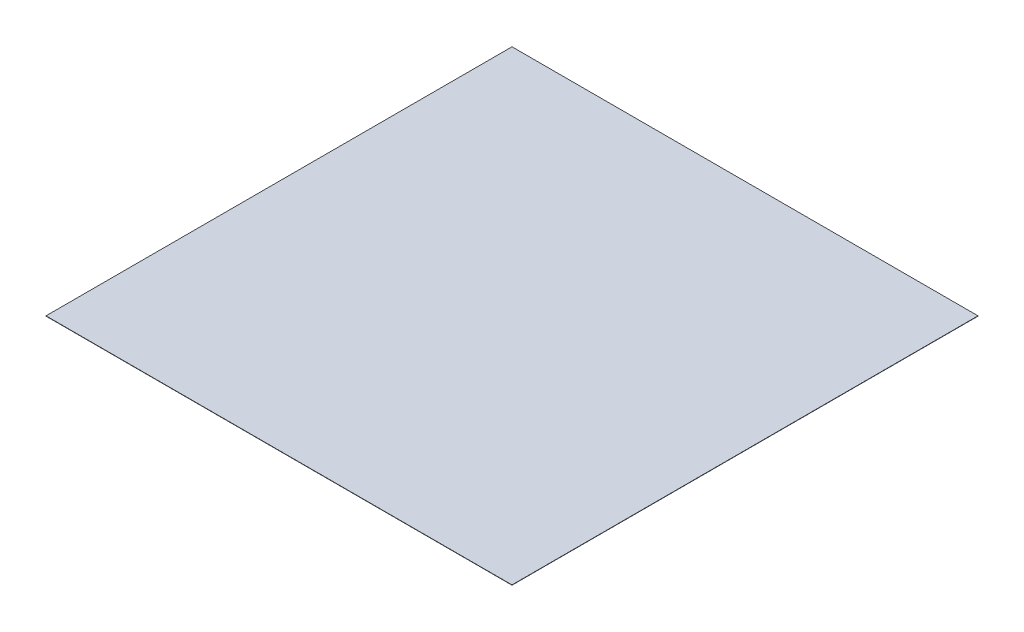
ISO-10303-21;
HEADER;
FILE_DESCRIPTION(('STEP AP214'),'2;1');
FILE_NAME('part.step','',(''),(''),'','','');
FILE_SCHEMA(('AUTOMOTIVE_DESIGN { 1 0 10303 214 1 1 1 1 }'));
ENDSEC;
DATA;
#1=APPLICATION_CONTEXT('core data for automotive mechanical design processes');
#2=APPLICATION_PROTOCOL_DEFINITION('international standard','automotive_design',2000,#1);
#3=PRODUCT_CONTEXT('',#1,'mechanical');
#4=PRODUCT('Part','Part','',(#3));
#5=PRODUCT_RELATED_PRODUCT_CATEGORY('part','',(#4));
#6=PRODUCT_DEFINITION_FORMATION('','',#4);
#7=PRODUCT_DEFINITION_CONTEXT('part definition',#1,'design');
#8=PRODUCT_DEFINITION('design','',#6,#7);
#9=PRODUCT_DEFINITION_SHAPE('','',#8);
#10=(LENGTH_UNIT() NAMED_UNIT(*) SI_UNIT(.MILLI.,.METRE.));
#11=(NAMED_UNIT(*) PLANE_ANGLE_UNIT() SI_UNIT($,.RADIAN.));
#12=(NAMED_UNIT(*) SI_UNIT($,.STERADIAN.) SOLID_ANGLE_UNIT());
#13=UNCERTAINTY_MEASURE_WITH_UNIT(LENGTH_MEASURE(1.E-05),#10,'distance_accuracy_value','');
#14=(GEOMETRIC_REPRESENTATION_CONTEXT(3) GLOBAL_UNCERTAINTY_ASSIGNED_CONTEXT((#13)) GLOBAL_UNIT_ASSIGNED_CONTEXT((#10,
#11,#12)) REPRESENTATION_CONTEXT('',''));
#15=CARTESIAN_POINT('',(0.,0.,0.));
#16=DIRECTION('',(0.,0.,1.));
#17=DIRECTION('',(1.,0.,0.));
#18=AXIS2_PLACEMENT_3D('',#15,#16,#17);
#19=CARTESIAN_POINT('',(-20.,0.025,-20.));
#20=DIRECTION('',(1.,0.,0.));
#21=DIRECTION('',(0.,0.,1.));
#22=AXIS2_PLACEMENT_3D('',#19,#20,#21);
#23=PLANE('',#22);
#24=DIRECTION('',(0.,0.,-1.));
#25=VECTOR('',#24,1.);
#26=CARTESIAN_POINT('',(-20.,0.,-20.));
#27=LINE('',#26,#25);
#28=CARTESIAN_POINT('',(-20.,0.,20.));
#29=VERTEX_POINT('',#28);
#30=CARTESIAN_POINT('',(-20.,0.,-20.));
#31=VERTEX_POINT('',#30);
#32=EDGE_CURVE('E98',#29,#31,#27,.T.);
#33=ORIENTED_EDGE('',*,*,#32,.F.);
#34=DIRECTION('',(0.,-1.,0.));
#35=VECTOR('',#34,1.);
#36=CARTESIAN_POINT('',(-20.,0.025,20.));
#37=LINE('',#36,#35);
#38=CARTESIAN_POINT('',(-20.,0.025,20.));
#39=VERTEX_POINT('',#38);
#40=EDGE_CURVE('E97',#39,#29,#37,.T.);
#41=ORIENTED_EDGE('',*,*,#40,.F.);
#42=DIRECTION('',(0.,0.,-1.));
#43=VECTOR('',#42,1.);
#44=CARTESIAN_POINT('',(-20.,0.025,-20.));
#45=LINE('',#44,#43);
#46=CARTESIAN_POINT('',(-20.,0.025,-20.));
#47=VERTEX_POINT('',#46);
#48=EDGE_CURVE('E92',#39,#47,#45,.T.);
#49=ORIENTED_EDGE('',*,*,#48,.T.);
#50=DIRECTION('',(0.,-1.,0.));
#51=VECTOR('',#50,1.);
#52=CARTESIAN_POINT('',(-20.,0.025,-20.));
#53=LINE('',#52,#51);
#54=EDGE_CURVE('E11',#47,#31,#53,.T.);
#55=ORIENTED_EDGE('',*,*,#54,.T.);
#56=EDGE_LOOP('',(#33,#41,#49,#55));
#57=FACE_BOUND('',#56,.T.);
#58=ADVANCED_FACE('F35',(#57),#23,.F.);
#59=CARTESIAN_POINT('',(20.,0.025,-20.));
#60=DIRECTION('',(0.,0.,1.));
#61=DIRECTION('',(-1.,0.,0.));
#62=AXIS2_PLACEMENT_3D('',#59,#60,#61);
#63=PLANE('',#62);
#64=DIRECTION('',(1.,0.,0.));
#65=VECTOR('',#64,1.);
#66=CARTESIAN_POINT('',(20.,0.,-20.));
#67=LINE('',#66,#65);
#68=CARTESIAN_POINT('',(20.,0.,-20.));
#69=VERTEX_POINT('',#68);
#70=EDGE_CURVE('E100',#31,#69,#67,.T.);
#71=ORIENTED_EDGE('',*,*,#70,.F.);
#72=ORIENTED_EDGE('',*,*,#54,.F.);
#73=DIRECTION('',(1.,0.,0.));
#74=VECTOR('',#73,1.);
#75=CARTESIAN_POINT('',(20.,0.025,-20.));
#76=LINE('',#75,#74);
#77=CARTESIAN_POINT('',(20.,0.025,-20.));
#78=VERTEX_POINT('',#77);
#79=EDGE_CURVE('E76',#47,#78,#76,.T.);
#80=ORIENTED_EDGE('',*,*,#79,.T.);
#81=DIRECTION('',(0.,-1.,0.));
#82=VECTOR('',#81,1.);
#83=CARTESIAN_POINT('',(20.,0.025,-20.));
#84=LINE('',#83,#82);
#85=EDGE_CURVE('E43',#78,#69,#84,.T.);
#86=ORIENTED_EDGE('',*,*,#85,.T.);
#87=EDGE_LOOP('',(#71,#72,#80,#86));
#88=FACE_BOUND('',#87,.T.);
#89=ADVANCED_FACE('F90',(#88),#63,.F.);
#90=CARTESIAN_POINT('',(20.,0.025,-20.));
#91=DIRECTION('',(-1.,0.,0.));
#92=DIRECTION('',(0.,0.,-1.));
#93=AXIS2_PLACEMENT_3D('',#90,#91,#92);
#94=PLANE('',#93);
#95=DIRECTION('',(0.,0.,1.));
#96=VECTOR('',#95,1.);
#97=CARTESIAN_POINT('',(20.,0.,-20.));
#98=LINE('',#97,#96);
#99=CARTESIAN_POINT('',(20.,0.,20.));
#100=VERTEX_POINT('',#99);
#101=EDGE_CURVE('E86',#69,#100,#98,.T.);
#102=ORIENTED_EDGE('',*,*,#101,.F.);
#103=ORIENTED_EDGE('',*,*,#85,.F.);
#104=DIRECTION('',(0.,0.,1.));
#105=VECTOR('',#104,1.);
#106=CARTESIAN_POINT('',(20.,0.025,-20.));
#107=LINE('',#106,#105);
#108=CARTESIAN_POINT('',(20.,0.025,20.));
#109=VERTEX_POINT('',#108);
#110=EDGE_CURVE('E79',#78,#109,#107,.T.);
#111=ORIENTED_EDGE('',*,*,#110,.T.);
#112=DIRECTION('',(0.,-1.,0.));
#113=VECTOR('',#112,1.);
#114=CARTESIAN_POINT('',(20.,0.025,20.));
#115=LINE('',#114,#113);
#116=EDGE_CURVE('E89',#109,#100,#115,.T.);
#117=ORIENTED_EDGE('',*,*,#116,.T.);
#118=EDGE_LOOP('',(#102,#103,#111,#117));
#119=FACE_BOUND('',#118,.T.);
#120=ADVANCED_FACE('F85',(#119),#94,.F.);
#121=CARTESIAN_POINT('',(20.,0.025,20.));
#122=DIRECTION('',(0.,0.,-1.));
#123=DIRECTION('',(1.,0.,0.));
#124=AXIS2_PLACEMENT_3D('',#121,#122,#123);
#125=PLANE('',#124);
#126=DIRECTION('',(-1.,0.,0.));
#127=VECTOR('',#126,1.);
#128=CARTESIAN_POINT('',(20.,0.,20.));
#129=LINE('',#128,#127);
#130=EDGE_CURVE('E65',#100,#29,#129,.T.);
#131=ORIENTED_EDGE('',*,*,#130,.F.);
#132=ORIENTED_EDGE('',*,*,#116,.F.);
#133=DIRECTION('',(-1.,0.,0.));
#134=VECTOR('',#133,1.);
#135=CARTESIAN_POINT('',(20.,0.025,20.));
#136=LINE('',#135,#134);
#137=EDGE_CURVE('E51',#109,#39,#136,.T.);
#138=ORIENTED_EDGE('',*,*,#137,.T.);
#139=ORIENTED_EDGE('',*,*,#40,.T.);
#140=EDGE_LOOP('',(#131,#132,#138,#139));
#141=FACE_BOUND('',#140,.T.);
#142=ADVANCED_FACE('F109',(#141),#125,.F.);
#143=CARTESIAN_POINT('',(0.,0.025,0.));
#144=DIRECTION('',(0.,1.,0.));
#145=DIRECTION('',(0.,0.,-1.));
#146=AXIS2_PLACEMENT_3D('',#143,#144,#145);
#147=PLANE('',#146);
#148=ORIENTED_EDGE('',*,*,#48,.F.);
#149=ORIENTED_EDGE('',*,*,#137,.F.);
#150=ORIENTED_EDGE('',*,*,#110,.F.);
#151=ORIENTED_EDGE('',*,*,#79,.F.);
#152=EDGE_LOOP('',(#148,#149,#150,#151));
#153=FACE_BOUND('',#152,.T.);
#154=ADVANCED_FACE('F81',(#153),#147,.T.);
#155=CARTESIAN_POINT('',(0.,0.,0.));
#156=DIRECTION('',(0.,1.,0.));
#157=DIRECTION('',(0.,0.,-1.));
#158=AXIS2_PLACEMENT_3D('',#155,#156,#157);
#159=PLANE('',#158);
#160=ORIENTED_EDGE('',*,*,#32,.T.);
#161=ORIENTED_EDGE('',*,*,#70,.T.);
#162=ORIENTED_EDGE('',*,*,#101,.T.);
#163=ORIENTED_EDGE('',*,*,#130,.T.);
#164=EDGE_LOOP('',(#160,#161,#162,#163));
#165=FACE_BOUND('',#164,.T.);
#166=ADVANCED_FACE('F105',(#165),#159,.F.);
#167=CLOSED_SHELL('',(#58,#89,#120,#142,#154,#166));
#168=MANIFOLD_SOLID_BREP('B2',#167);
#169=ADVANCED_BREP_SHAPE_REPRESENTATION('',(#18,#168),#14);
#170=SHAPE_DEFINITION_REPRESENTATION(#9,#169);
ENDSEC;
END-ISO-10303-21;
